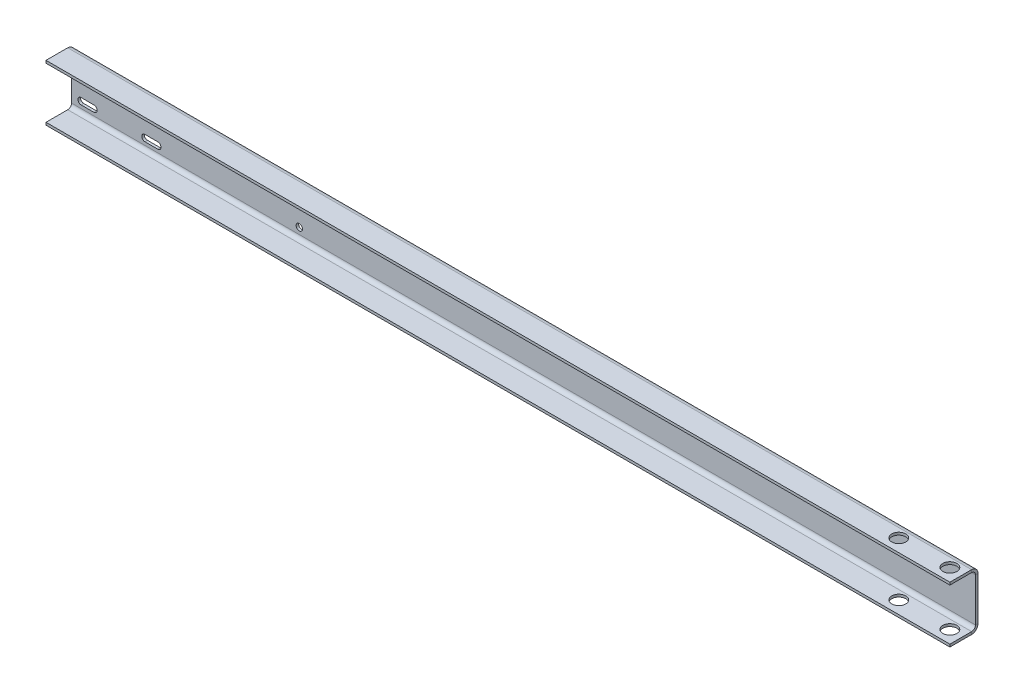
ISO-10303-21;
HEADER;
FILE_DESCRIPTION(('STEP AP214'),'2;1');
FILE_NAME('part.step','',(''),(''),'','','');
FILE_SCHEMA(('AUTOMOTIVE_DESIGN { 1 0 10303 214 1 1 1 1 }'));
ENDSEC;
DATA;
#1=APPLICATION_CONTEXT('core data for automotive mechanical design processes');
#2=APPLICATION_PROTOCOL_DEFINITION('international standard','automotive_design',2000,#1);
#3=PRODUCT_CONTEXT('',#1,'mechanical');
#4=PRODUCT('Part','Part','',(#3));
#5=PRODUCT_RELATED_PRODUCT_CATEGORY('part','',(#4));
#6=PRODUCT_DEFINITION_FORMATION('','',#4);
#7=PRODUCT_DEFINITION_CONTEXT('part definition',#1,'design');
#8=PRODUCT_DEFINITION('design','',#6,#7);
#9=PRODUCT_DEFINITION_SHAPE('','',#8);
#10=(LENGTH_UNIT() NAMED_UNIT(*) SI_UNIT(.MILLI.,.METRE.));
#11=(NAMED_UNIT(*) PLANE_ANGLE_UNIT() SI_UNIT($,.RADIAN.));
#12=(NAMED_UNIT(*) SI_UNIT($,.STERADIAN.) SOLID_ANGLE_UNIT());
#13=UNCERTAINTY_MEASURE_WITH_UNIT(LENGTH_MEASURE(1.E-05),#10,'distance_accuracy_value','');
#14=(GEOMETRIC_REPRESENTATION_CONTEXT(3) GLOBAL_UNCERTAINTY_ASSIGNED_CONTEXT((#13)) GLOBAL_UNIT_ASSIGNED_CONTEXT((#10,
#11,#12)) REPRESENTATION_CONTEXT('',''));
#15=CARTESIAN_POINT('',(0.,0.,0.));
#16=DIRECTION('',(0.,0.,1.));
#17=DIRECTION('',(1.,0.,0.));
#18=AXIS2_PLACEMENT_3D('',#15,#16,#17);
#19=CARTESIAN_POINT('',(0.,0.,-4.));
#20=DIRECTION('',(0.,0.,-1.));
#21=DIRECTION('',(-1.,0.,0.));
#22=AXIS2_PLACEMENT_3D('',#19,#20,#21);
#23=PLANE('',#22);
#24=CARTESIAN_POINT('',(-509.018987341773,19.9999999999998,-4.));
#25=DIRECTION('',(0.,0.,-1.));
#26=DIRECTION('',(-1.,0.,0.));
#27=AXIS2_PLACEMENT_3D('',#24,#25,#26);
#28=CIRCLE('',#27,5.00000000000004);
#29=CARTESIAN_POINT('',(-514.018987341773,19.9999999999998,-4.));
#30=VERTEX_POINT('',#29);
#31=EDGE_CURVE('E878',#30,#30,#28,.T.);
#32=ORIENTED_EDGE('',*,*,#31,.F.);
#33=EDGE_LOOP('',(#32));
#34=FACE_BOUND('',#33,.T.);
#35=CARTESIAN_POINT('',(-750.518987341773,19.9999999999999,-4.));
#36=DIRECTION('',(0.,0.,-1.));
#37=DIRECTION('',(-1.,0.,0.));
#38=AXIS2_PLACEMENT_3D('',#35,#36,#37);
#39=CIRCLE('',#38,5.);
#40=CARTESIAN_POINT('',(-750.518987341773,14.9999999999999,-4.));
#41=VERTEX_POINT('',#40);
#42=CARTESIAN_POINT('',(-750.518987341773,24.9999999999999,-4.));
#43=VERTEX_POINT('',#42);
#44=EDGE_CURVE('E95',#41,#43,#39,.T.);
#45=ORIENTED_EDGE('',*,*,#44,.F.);
#46=DIRECTION('',(-1.,0.,0.));
#47=VECTOR('',#46,1.);
#48=CARTESIAN_POINT('',(-750.518987341773,14.9999999999999,-4.));
#49=LINE('',#48,#47);
#50=CARTESIAN_POINT('',(-730.518987341773,14.9999999999999,-4.));
#51=VERTEX_POINT('',#50);
#52=EDGE_CURVE('E235',#51,#41,#49,.T.);
#53=ORIENTED_EDGE('',*,*,#52,.F.);
#54=CARTESIAN_POINT('',(-730.518987341773,19.9999999999999,-4.));
#55=DIRECTION('',(0.,0.,-1.));
#56=DIRECTION('',(-1.,0.,0.));
#57=AXIS2_PLACEMENT_3D('',#54,#55,#56);
#58=CIRCLE('',#57,5.);
#59=CARTESIAN_POINT('',(-730.518987341773,24.9999999999999,-4.));
#60=VERTEX_POINT('',#59);
#61=EDGE_CURVE('E220',#60,#51,#58,.T.);
#62=ORIENTED_EDGE('',*,*,#61,.F.);
#63=DIRECTION('',(1.,0.,0.));
#64=VECTOR('',#63,1.);
#65=CARTESIAN_POINT('',(-750.518987341773,24.9999999999999,-4.));
#66=LINE('',#65,#64);
#67=EDGE_CURVE('E229',#43,#60,#66,.T.);
#68=ORIENTED_EDGE('',*,*,#67,.F.);
#69=EDGE_LOOP('',(#45,#53,#62,#68));
#70=FACE_BOUND('',#69,.T.);
#71=CARTESIAN_POINT('',(-850.518987341773,19.9999999999999,-4.));
#72=DIRECTION('',(0.,0.,-1.));
#73=DIRECTION('',(-1.,0.,0.));
#74=AXIS2_PLACEMENT_3D('',#71,#72,#73);
#75=CIRCLE('',#74,5.);
#76=CARTESIAN_POINT('',(-850.518987341773,14.9999999999999,-4.));
#77=VERTEX_POINT('',#76);
#78=CARTESIAN_POINT('',(-850.518987341773,24.9999999999999,-4.));
#79=VERTEX_POINT('',#78);
#80=EDGE_CURVE('E242',#77,#79,#75,.T.);
#81=ORIENTED_EDGE('',*,*,#80,.F.);
#82=DIRECTION('',(-1.,0.,0.));
#83=VECTOR('',#82,1.);
#84=CARTESIAN_POINT('',(-850.518987341773,14.9999999999999,-4.));
#85=LINE('',#84,#83);
#86=CARTESIAN_POINT('',(-830.518987341773,14.9999999999999,-4.));
#87=VERTEX_POINT('',#86);
#88=EDGE_CURVE('E252',#87,#77,#85,.T.);
#89=ORIENTED_EDGE('',*,*,#88,.F.);
#90=CARTESIAN_POINT('',(-830.518987341773,19.9999999999999,-4.));
#91=DIRECTION('',(0.,0.,-1.));
#92=DIRECTION('',(-1.,0.,0.));
#93=AXIS2_PLACEMENT_3D('',#90,#91,#92);
#94=CIRCLE('',#93,5.);
#95=CARTESIAN_POINT('',(-830.518987341773,24.9999999999999,-4.));
#96=VERTEX_POINT('',#95);
#97=EDGE_CURVE('E249',#96,#87,#94,.T.);
#98=ORIENTED_EDGE('',*,*,#97,.F.);
#99=DIRECTION('',(1.,0.,0.));
#100=VECTOR('',#99,1.);
#101=CARTESIAN_POINT('',(-850.518987341773,24.9999999999999,-4.));
#102=LINE('',#101,#100);
#103=EDGE_CURVE('E246',#79,#96,#102,.T.);
#104=ORIENTED_EDGE('',*,*,#103,.F.);
#105=EDGE_LOOP('',(#81,#89,#98,#104));
#106=FACE_BOUND('',#105,.T.);
#107=DIRECTION('',(0.,1.,0.));
#108=VECTOR('',#107,1.);
#109=CARTESIAN_POINT('',(549.481012658227,88.0000000000002,-4.));
#110=LINE('',#109,#108);
#111=CARTESIAN_POINT('',(549.481012658227,9.99999999999997,-3.99999999999986));
#112=VERTEX_POINT('',#111);
#113=CARTESIAN_POINT('',(549.481012658227,78.,-4.));
#114=VERTEX_POINT('',#113);
#115=EDGE_CURVE('E396',#112,#114,#110,.T.);
#116=ORIENTED_EDGE('',*,*,#115,.F.);
#117=DIRECTION('',(1.,0.,0.));
#118=VECTOR('',#117,1.);
#119=CARTESIAN_POINT('',(549.481012658227,9.99999999999997,-3.99999999999986));
#120=LINE('',#119,#118);
#121=CARTESIAN_POINT('',(-865.518987341773,9.99999999999967,-4.));
#122=VERTEX_POINT('',#121);
#123=EDGE_CURVE('E317',#112,#122,#120,.F.);
#124=ORIENTED_EDGE('',*,*,#123,.T.);
#125=DIRECTION('',(0.,-1.,0.));
#126=VECTOR('',#125,1.);
#127=CARTESIAN_POINT('',(-865.518987341773,88.,-4.));
#128=LINE('',#127,#126);
#129=CARTESIAN_POINT('',(-865.518987341773,78.,-4.00000000000008));
#130=VERTEX_POINT('',#129);
#131=EDGE_CURVE('E398',#130,#122,#128,.T.);
#132=ORIENTED_EDGE('',*,*,#131,.F.);
#133=DIRECTION('',(-1.,0.,0.));
#134=VECTOR('',#133,1.);
#135=CARTESIAN_POINT('',(-865.518987341773,78.,-4.00000000000008));
#136=LINE('',#135,#134);
#137=EDGE_CURVE('E372',#130,#114,#136,.F.);
#138=ORIENTED_EDGE('',*,*,#137,.T.);
#139=EDGE_LOOP('',(#116,#124,#132,#138));
#140=FACE_BOUND('',#139,.T.);
#141=ADVANCED_FACE('F79',(#34,#70,#106,#140),#23,.T.);
#142=CARTESIAN_POINT('',(0.,0.,0.));
#143=DIRECTION('',(0.,0.,-1.));
#144=DIRECTION('',(-1.,0.,0.));
#145=AXIS2_PLACEMENT_3D('',#142,#143,#144);
#146=PLANE('',#145);
#147=CARTESIAN_POINT('',(-509.018987341773,19.9999999999998,0.));
#148=DIRECTION('',(0.,0.,-1.));
#149=DIRECTION('',(-1.,0.,0.));
#150=AXIS2_PLACEMENT_3D('',#147,#148,#149);
#151=CIRCLE('',#150,5.00000000000004);
#152=CARTESIAN_POINT('',(-514.018987341773,19.9999999999998,0.));
#153=VERTEX_POINT('',#152);
#154=EDGE_CURVE('E83',#153,#153,#151,.T.);
#155=ORIENTED_EDGE('',*,*,#154,.T.);
#156=EDGE_LOOP('',(#155));
#157=FACE_BOUND('',#156,.T.);
#158=DIRECTION('',(-1.,0.,0.));
#159=VECTOR('',#158,1.);
#160=CARTESIAN_POINT('',(0.,14.9999999999999,0.));
#161=LINE('',#160,#159);
#162=CARTESIAN_POINT('',(-730.518987341773,14.9999999999999,0.));
#163=VERTEX_POINT('',#162);
#164=CARTESIAN_POINT('',(-750.518987341773,14.9999999999999,0.));
#165=VERTEX_POINT('',#164);
#166=EDGE_CURVE('E88',#163,#165,#161,.T.);
#167=ORIENTED_EDGE('',*,*,#166,.T.);
#168=CARTESIAN_POINT('',(-750.518987341773,19.9999999999999,0.));
#169=DIRECTION('',(0.,0.,-1.));
#170=DIRECTION('',(-1.,0.,0.));
#171=AXIS2_PLACEMENT_3D('',#168,#169,#170);
#172=CIRCLE('',#171,5.);
#173=CARTESIAN_POINT('',(-750.518987341773,24.9999999999999,0.));
#174=VERTEX_POINT('',#173);
#175=EDGE_CURVE('E13',#165,#174,#172,.T.);
#176=ORIENTED_EDGE('',*,*,#175,.T.);
#177=DIRECTION('',(1.,0.,0.));
#178=VECTOR('',#177,1.);
#179=CARTESIAN_POINT('',(0.,24.9999999999999,0.));
#180=LINE('',#179,#178);
#181=CARTESIAN_POINT('',(-730.518987341773,24.9999999999999,0.));
#182=VERTEX_POINT('',#181);
#183=EDGE_CURVE('E421',#174,#182,#180,.T.);
#184=ORIENTED_EDGE('',*,*,#183,.T.);
#185=CARTESIAN_POINT('',(-730.518987341773,19.9999999999999,0.));
#186=DIRECTION('',(0.,0.,-1.));
#187=DIRECTION('',(-1.,0.,0.));
#188=AXIS2_PLACEMENT_3D('',#185,#186,#187);
#189=CIRCLE('',#188,5.);
#190=EDGE_CURVE('E223',#182,#163,#189,.T.);
#191=ORIENTED_EDGE('',*,*,#190,.T.);
#192=EDGE_LOOP('',(#167,#176,#184,#191));
#193=FACE_BOUND('',#192,.T.);
#194=DIRECTION('',(-1.,0.,0.));
#195=VECTOR('',#194,1.);
#196=CARTESIAN_POINT('',(0.,14.9999999999999,0.));
#197=LINE('',#196,#195);
#198=CARTESIAN_POINT('',(-830.518987341773,14.9999999999999,0.));
#199=VERTEX_POINT('',#198);
#200=CARTESIAN_POINT('',(-850.518987341773,14.9999999999999,0.));
#201=VERTEX_POINT('',#200);
#202=EDGE_CURVE('E415',#199,#201,#197,.T.);
#203=ORIENTED_EDGE('',*,*,#202,.T.);
#204=CARTESIAN_POINT('',(-850.518987341773,19.9999999999999,0.));
#205=DIRECTION('',(0.,0.,-1.));
#206=DIRECTION('',(-1.,0.,0.));
#207=AXIS2_PLACEMENT_3D('',#204,#205,#206);
#208=CIRCLE('',#207,5.);
#209=CARTESIAN_POINT('',(-850.518987341773,24.9999999999999,0.));
#210=VERTEX_POINT('',#209);
#211=EDGE_CURVE('E418',#201,#210,#208,.T.);
#212=ORIENTED_EDGE('',*,*,#211,.T.);
#213=DIRECTION('',(1.,0.,0.));
#214=VECTOR('',#213,1.);
#215=CARTESIAN_POINT('',(0.,24.9999999999999,0.));
#216=LINE('',#215,#214);
#217=CARTESIAN_POINT('',(-830.518987341773,24.9999999999999,0.));
#218=VERTEX_POINT('',#217);
#219=EDGE_CURVE('E402',#210,#218,#216,.T.);
#220=ORIENTED_EDGE('',*,*,#219,.T.);
#221=CARTESIAN_POINT('',(-830.518987341773,19.9999999999999,0.));
#222=DIRECTION('',(0.,0.,-1.));
#223=DIRECTION('',(-1.,0.,0.));
#224=AXIS2_PLACEMENT_3D('',#221,#222,#223);
#225=CIRCLE('',#224,5.);
#226=EDGE_CURVE('E412',#218,#199,#225,.T.);
#227=ORIENTED_EDGE('',*,*,#226,.T.);
#228=EDGE_LOOP('',(#203,#212,#220,#227));
#229=FACE_BOUND('',#228,.T.);
#230=DIRECTION('',(1.,0.,0.));
#231=VECTOR('',#230,1.);
#232=CARTESIAN_POINT('',(549.481012658227,10.,1.38777878078145E-13));
#233=LINE('',#232,#231);
#234=CARTESIAN_POINT('',(549.481012658227,10.,1.38777878078145E-13));
#235=VERTEX_POINT('',#234);
#236=CARTESIAN_POINT('',(-865.518987341773,9.99999999999964,1.38777878078145E-13));
#237=VERTEX_POINT('',#236);
#238=EDGE_CURVE('E330',#235,#237,#233,.F.);
#239=ORIENTED_EDGE('',*,*,#238,.F.);
#240=DIRECTION('',(0.,1.,0.));
#241=VECTOR('',#240,1.);
#242=CARTESIAN_POINT('',(549.481012658227,88.0000000000002,0.));
#243=LINE('',#242,#241);
#244=CARTESIAN_POINT('',(549.481012658227,78.,0.));
#245=VERTEX_POINT('',#244);
#246=EDGE_CURVE('E393',#235,#245,#243,.T.);
#247=ORIENTED_EDGE('',*,*,#246,.T.);
#248=DIRECTION('',(-1.,0.,0.));
#249=VECTOR('',#248,1.);
#250=CARTESIAN_POINT('',(-865.518987341773,78.,0.));
#251=LINE('',#250,#249);
#252=CARTESIAN_POINT('',(-865.518987341773,78.,0.));
#253=VERTEX_POINT('',#252);
#254=EDGE_CURVE('E385',#253,#245,#251,.F.);
#255=ORIENTED_EDGE('',*,*,#254,.F.);
#256=DIRECTION('',(0.,-1.,0.));
#257=VECTOR('',#256,1.);
#258=CARTESIAN_POINT('',(-865.518987341773,88.,0.));
#259=LINE('',#258,#257);
#260=EDGE_CURVE('E399',#253,#237,#259,.T.);
#261=ORIENTED_EDGE('',*,*,#260,.T.);
#262=EDGE_LOOP('',(#239,#247,#255,#261));
#263=FACE_BOUND('',#262,.T.);
#264=ADVANCED_FACE('F426',(#157,#193,#229,#263),#146,.F.);
#265=CARTESIAN_POINT('',(549.481012658227,88.0000000000002,-4.));
#266=DIRECTION('',(1.,0.,0.));
#267=DIRECTION('',(0.,0.,-1.));
#268=AXIS2_PLACEMENT_3D('',#265,#266,#267);
#269=PLANE('',#268);
#270=ORIENTED_EDGE('',*,*,#246,.F.);
#271=DIRECTION('',(0.,0.,-1.));
#272=VECTOR('',#271,1.);
#273=CARTESIAN_POINT('',(549.481012658227,10.,1.38777878078145E-13));
#274=LINE('',#273,#272);
#275=EDGE_CURVE('E324',#235,#112,#274,.T.);
#276=ORIENTED_EDGE('',*,*,#275,.T.);
#277=ORIENTED_EDGE('',*,*,#115,.T.);
#278=DIRECTION('',(0.,0.,-1.));
#279=VECTOR('',#278,1.);
#280=CARTESIAN_POINT('',(549.481012658227,78.,0.));
#281=LINE('',#280,#279);
#282=EDGE_CURVE('E390',#245,#114,#281,.T.);
#283=ORIENTED_EDGE('',*,*,#282,.F.);
#284=EDGE_LOOP('',(#270,#276,#277,#283));
#285=FACE_BOUND('',#284,.T.);
#286=ADVANCED_FACE('F81',(#285),#269,.T.);
#287=CARTESIAN_POINT('',(-865.518987341773,88.,-4.));
#288=DIRECTION('',(-1.,0.,0.));
#289=DIRECTION('',(0.,0.,1.));
#290=AXIS2_PLACEMENT_3D('',#287,#288,#289);
#291=PLANE('',#290);
#292=DIRECTION('',(0.,0.,-1.));
#293=VECTOR('',#292,1.);
#294=CARTESIAN_POINT('',(-865.518987341773,9.99999999999964,1.38777878078145E-13));
#295=LINE('',#294,#293);
#296=EDGE_CURVE('E334',#237,#122,#295,.T.);
#297=ORIENTED_EDGE('',*,*,#296,.F.);
#298=ORIENTED_EDGE('',*,*,#260,.F.);
#299=DIRECTION('',(0.,0.,-1.));
#300=VECTOR('',#299,1.);
#301=CARTESIAN_POINT('',(-865.518987341773,78.,0.));
#302=LINE('',#301,#300);
#303=EDGE_CURVE('E379',#253,#130,#302,.T.);
#304=ORIENTED_EDGE('',*,*,#303,.T.);
#305=ORIENTED_EDGE('',*,*,#131,.T.);
#306=EDGE_LOOP('',(#297,#298,#304,#305));
#307=FACE_BOUND('',#306,.T.);
#308=ADVANCED_FACE('F457',(#307),#291,.T.);
#309=CARTESIAN_POINT('',(549.481012658227,78.0000000000001,6.00000000000003));
#310=DIRECTION('',(1.,0.,0.));
#311=DIRECTION('',(0.,0.,-1.));
#312=AXIS2_PLACEMENT_3D('',#309,#310,#311);
#313=PLANE('',#312);
#314=DIRECTION('',(0.,1.,0.));
#315=VECTOR('',#314,1.);
#316=CARTESIAN_POINT('',(549.481012658227,88.0000000000002,5.99999999999996));
#317=LINE('',#316,#315);
#318=CARTESIAN_POINT('',(549.481012658227,84.0000000000002,6.00000000000001));
#319=VERTEX_POINT('',#318);
#320=CARTESIAN_POINT('',(549.481012658227,88.0000000000002,5.99999999999999));
#321=VERTEX_POINT('',#320);
#322=EDGE_CURVE('E337',#319,#321,#317,.T.);
#323=ORIENTED_EDGE('',*,*,#322,.F.);
#324=CARTESIAN_POINT('',(549.481012658227,78.0000000000001,6.00000000000003));
#325=DIRECTION('',(-1.,0.,0.));
#326=DIRECTION('',(0.,0.,1.));
#327=AXIS2_PLACEMENT_3D('',#324,#325,#326);
#328=CIRCLE('',#327,6.0000000000001);
#329=EDGE_CURVE('E382',#245,#319,#328,.F.);
#330=ORIENTED_EDGE('',*,*,#329,.F.);
#331=ORIENTED_EDGE('',*,*,#282,.T.);
#332=CARTESIAN_POINT('',(549.481012658227,78.0000000000001,6.00000000000003));
#333=DIRECTION('',(-1.,0.,0.));
#334=DIRECTION('',(0.,0.,1.));
#335=AXIS2_PLACEMENT_3D('',#332,#333,#334);
#336=CIRCLE('',#335,10.0000000000001);
#337=EDGE_CURVE('E375',#114,#321,#336,.F.);
#338=ORIENTED_EDGE('',*,*,#337,.T.);
#339=EDGE_LOOP('',(#323,#330,#331,#338));
#340=FACE_BOUND('',#339,.T.);
#341=ADVANCED_FACE('F459',(#340),#313,.T.);
#342=CARTESIAN_POINT('',(-865.518987341773,78.0000000000001,6.00000000000003));
#343=DIRECTION('',(1.,0.,0.));
#344=DIRECTION('',(0.,0.,-1.));
#345=AXIS2_PLACEMENT_3D('',#342,#343,#344);
#346=PLANE('',#345);
#347=CARTESIAN_POINT('',(-865.518987341773,78.0000000000001,6.00000000000003));
#348=DIRECTION('',(-1.,0.,0.));
#349=DIRECTION('',(0.,0.,1.));
#350=AXIS2_PLACEMENT_3D('',#347,#348,#349);
#351=CIRCLE('',#350,6.0000000000001);
#352=CARTESIAN_POINT('',(-865.518987341773,84.0000000000002,6.00000000000001));
#353=VERTEX_POINT('',#352);
#354=EDGE_CURVE('E342',#353,#253,#351,.T.);
#355=ORIENTED_EDGE('',*,*,#354,.F.);
#356=DIRECTION('',(0.,1.,0.));
#357=VECTOR('',#356,1.);
#358=CARTESIAN_POINT('',(-865.518987341773,84.,6.00000000000003));
#359=LINE('',#358,#357);
#360=CARTESIAN_POINT('',(-865.518987341773,88.,6.00000000000002));
#361=VERTEX_POINT('',#360);
#362=EDGE_CURVE('E365',#353,#361,#359,.T.);
#363=ORIENTED_EDGE('',*,*,#362,.T.);
#364=CARTESIAN_POINT('',(-865.518987341773,78.0000000000001,6.00000000000003));
#365=DIRECTION('',(-1.,0.,0.));
#366=DIRECTION('',(0.,0.,1.));
#367=AXIS2_PLACEMENT_3D('',#364,#365,#366);
#368=CIRCLE('',#367,10.0000000000001);
#369=EDGE_CURVE('E376',#361,#130,#368,.T.);
#370=ORIENTED_EDGE('',*,*,#369,.T.);
#371=ORIENTED_EDGE('',*,*,#303,.F.);
#372=EDGE_LOOP('',(#355,#363,#370,#371));
#373=FACE_BOUND('',#372,.T.);
#374=ADVANCED_FACE('F455',(#373),#346,.F.);
#375=CARTESIAN_POINT('',(-865.518987341773,78.0000000000001,6.00000000000003));
#376=DIRECTION('',(-1.,0.,0.));
#377=DIRECTION('',(0.,1.,0.));
#378=AXIS2_PLACEMENT_3D('',#375,#376,#377);
#379=CYLINDRICAL_SURFACE('',#378,10.0000000000001);
#380=ORIENTED_EDGE('',*,*,#137,.F.);
#381=ORIENTED_EDGE('',*,*,#369,.F.);
#382=DIRECTION('',(-1.,0.,0.));
#383=VECTOR('',#382,1.);
#384=CARTESIAN_POINT('',(0.,88.0000000000001,5.99999999999999));
#385=LINE('',#384,#383);
#386=EDGE_CURVE('E362',#321,#361,#385,.T.);
#387=ORIENTED_EDGE('',*,*,#386,.F.);
#388=ORIENTED_EDGE('',*,*,#337,.F.);
#389=EDGE_LOOP('',(#380,#381,#387,#388));
#390=FACE_BOUND('',#389,.T.);
#391=ADVANCED_FACE('F486',(#390),#379,.T.);
#392=CARTESIAN_POINT('',(-865.518987341773,78.0000000000001,6.00000000000003));
#393=DIRECTION('',(-1.,0.,0.));
#394=DIRECTION('',(0.,1.,0.));
#395=AXIS2_PLACEMENT_3D('',#392,#393,#394);
#396=CYLINDRICAL_SURFACE('',#395,6.0000000000001);
#397=ORIENTED_EDGE('',*,*,#254,.T.);
#398=ORIENTED_EDGE('',*,*,#329,.T.);
#399=DIRECTION('',(1.,0.,0.));
#400=VECTOR('',#399,1.);
#401=CARTESIAN_POINT('',(549.481012658227,84.0000000000002,5.99999999999998));
#402=LINE('',#401,#400);
#403=EDGE_CURVE('E368',#319,#353,#402,.F.);
#404=ORIENTED_EDGE('',*,*,#403,.T.);
#405=ORIENTED_EDGE('',*,*,#354,.T.);
#406=EDGE_LOOP('',(#397,#398,#404,#405));
#407=FACE_BOUND('',#406,.T.);
#408=ADVANCED_FACE('F478',(#407),#396,.F.);
#409=CARTESIAN_POINT('',(-865.518987341773,88.,0.));
#410=DIRECTION('',(-1.,0.,0.));
#411=DIRECTION('',(0.,-1.,0.));
#412=AXIS2_PLACEMENT_3D('',#409,#410,#411);
#413=PLANE('',#412);
#414=DIRECTION('',(0.,0.,-1.));
#415=VECTOR('',#414,1.);
#416=CARTESIAN_POINT('',(-865.518987341773,88.,0.));
#417=LINE('',#416,#415);
#418=CARTESIAN_POINT('',(-865.518987341773,88.0000000000001,40.));
#419=VERTEX_POINT('',#418);
#420=EDGE_CURVE('E346',#419,#361,#417,.T.);
#421=ORIENTED_EDGE('',*,*,#420,.T.);
#422=ORIENTED_EDGE('',*,*,#362,.F.);
#423=DIRECTION('',(0.,0.,1.));
#424=VECTOR('',#423,1.);
#425=CARTESIAN_POINT('',(-865.518987341773,84.,-3.05311331771918E-13));
#426=LINE('',#425,#424);
#427=CARTESIAN_POINT('',(-865.518987341773,84.0000000000001,40.));
#428=VERTEX_POINT('',#427);
#429=EDGE_CURVE('E354',#428,#353,#426,.F.);
#430=ORIENTED_EDGE('',*,*,#429,.F.);
#431=DIRECTION('',(0.,-1.,0.));
#432=VECTOR('',#431,1.);
#433=CARTESIAN_POINT('',(-865.518987341773,88.0000000000001,40.));
#434=LINE('',#433,#432);
#435=EDGE_CURVE('E340',#419,#428,#434,.T.);
#436=ORIENTED_EDGE('',*,*,#435,.F.);
#437=EDGE_LOOP('',(#421,#422,#430,#436));
#438=FACE_BOUND('',#437,.T.);
#439=ADVANCED_FACE('F504',(#438),#413,.T.);
#440=CARTESIAN_POINT('',(549.481012658227,88.0000000000003,40.));
#441=DIRECTION('',(1.,0.,0.));
#442=DIRECTION('',(0.,1.,0.));
#443=AXIS2_PLACEMENT_3D('',#440,#441,#442);
#444=PLANE('',#443);
#445=DIRECTION('',(0.,0.,-1.));
#446=VECTOR('',#445,1.);
#447=CARTESIAN_POINT('',(549.481012658227,84.0000000000002,-3.05311331771919E-13));
#448=LINE('',#447,#446);
#449=CARTESIAN_POINT('',(549.481012658227,84.0000000000003,40.));
#450=VERTEX_POINT('',#449);
#451=EDGE_CURVE('E360',#319,#450,#448,.F.);
#452=ORIENTED_EDGE('',*,*,#451,.F.);
#453=ORIENTED_EDGE('',*,*,#322,.T.);
#454=DIRECTION('',(0.,0.,1.));
#455=VECTOR('',#454,1.);
#456=CARTESIAN_POINT('',(549.481012658227,88.0000000000003,40.));
#457=LINE('',#456,#455);
#458=CARTESIAN_POINT('',(549.481012658227,88.0000000000003,40.));
#459=VERTEX_POINT('',#458);
#460=EDGE_CURVE('E352',#321,#459,#457,.T.);
#461=ORIENTED_EDGE('',*,*,#460,.T.);
#462=DIRECTION('',(0.,-1.,0.));
#463=VECTOR('',#462,1.);
#464=CARTESIAN_POINT('',(549.481012658227,88.0000000000003,40.));
#465=LINE('',#464,#463);
#466=EDGE_CURVE('E343',#459,#450,#465,.T.);
#467=ORIENTED_EDGE('',*,*,#466,.T.);
#468=EDGE_LOOP('',(#452,#453,#461,#467));
#469=FACE_BOUND('',#468,.T.);
#470=ADVANCED_FACE('F490',(#469),#444,.T.);
#471=CARTESIAN_POINT('',(0.,88.0000000000001,-3.19277257127291E-13));
#472=DIRECTION('',(0.,1.,0.));
#473=DIRECTION('',(0.,0.,1.));
#474=AXIS2_PLACEMENT_3D('',#471,#472,#473);
#475=PLANE('',#474);
#476=CARTESIAN_POINT('',(449.481012658227,88.0000000000006,20.0000000000003));
#477=DIRECTION('',(0.,-1.,0.));
#478=DIRECTION('',(0.,0.,-1.));
#479=AXIS2_PLACEMENT_3D('',#476,#477,#478);
#480=CIRCLE('',#479,11.);
#481=CARTESIAN_POINT('',(449.481012658227,88.0000000000006,9.00000000000028));
#482=VERTEX_POINT('',#481);
#483=EDGE_CURVE('E258',#482,#482,#480,.T.);
#484=ORIENTED_EDGE('',*,*,#483,.T.);
#485=EDGE_LOOP('',(#484));
#486=FACE_BOUND('',#485,.T.);
#487=CARTESIAN_POINT('',(529.481012658227,88.0000000000006,20.0000000000003));
#488=DIRECTION('',(0.,-1.,0.));
#489=DIRECTION('',(0.,0.,-1.));
#490=AXIS2_PLACEMENT_3D('',#487,#488,#489);
#491=CIRCLE('',#490,11.);
#492=CARTESIAN_POINT('',(529.481012658227,88.0000000000006,9.00000000000028));
#493=VERTEX_POINT('',#492);
#494=EDGE_CURVE('E274',#493,#493,#491,.T.);
#495=ORIENTED_EDGE('',*,*,#494,.T.);
#496=EDGE_LOOP('',(#495));
#497=FACE_BOUND('',#496,.T.);
#498=ORIENTED_EDGE('',*,*,#460,.F.);
#499=ORIENTED_EDGE('',*,*,#386,.T.);
#500=ORIENTED_EDGE('',*,*,#420,.F.);
#501=DIRECTION('',(-1.,0.,0.));
#502=VECTOR('',#501,1.);
#503=CARTESIAN_POINT('',(-865.518987341773,88.0000000000001,40.));
#504=LINE('',#503,#502);
#505=EDGE_CURVE('E349',#459,#419,#504,.T.);
#506=ORIENTED_EDGE('',*,*,#505,.F.);
#507=EDGE_LOOP('',(#498,#499,#500,#506));
#508=FACE_BOUND('',#507,.T.);
#509=ADVANCED_FACE('F494',(#486,#497,#508),#475,.T.);
#510=CARTESIAN_POINT('',(0.,84.0000000000001,-3.05311331771918E-13));
#511=DIRECTION('',(0.,1.,0.));
#512=DIRECTION('',(0.,0.,1.));
#513=AXIS2_PLACEMENT_3D('',#510,#511,#512);
#514=PLANE('',#513);
#515=CARTESIAN_POINT('',(449.481012658227,84.0000000000002,20.0000000000003));
#516=DIRECTION('',(0.,1.,0.));
#517=DIRECTION('',(0.,0.,1.));
#518=AXIS2_PLACEMENT_3D('',#515,#516,#517);
#519=CIRCLE('',#518,11.);
#520=CARTESIAN_POINT('',(449.481012658227,84.0000000000003,31.0000000000003));
#521=VERTEX_POINT('',#520);
#522=EDGE_CURVE('E271',#521,#521,#519,.T.);
#523=ORIENTED_EDGE('',*,*,#522,.T.);
#524=EDGE_LOOP('',(#523));
#525=FACE_BOUND('',#524,.T.);
#526=CARTESIAN_POINT('',(529.481012658227,84.0000000000002,20.0000000000003));
#527=DIRECTION('',(0.,1.,0.));
#528=DIRECTION('',(0.,0.,1.));
#529=AXIS2_PLACEMENT_3D('',#526,#527,#528);
#530=CIRCLE('',#529,11.);
#531=CARTESIAN_POINT('',(529.481012658227,84.0000000000003,31.0000000000003));
#532=VERTEX_POINT('',#531);
#533=EDGE_CURVE('E281',#532,#532,#530,.T.);
#534=ORIENTED_EDGE('',*,*,#533,.T.);
#535=EDGE_LOOP('',(#534));
#536=FACE_BOUND('',#535,.T.);
#537=ORIENTED_EDGE('',*,*,#403,.F.);
#538=ORIENTED_EDGE('',*,*,#451,.T.);
#539=DIRECTION('',(1.,0.,0.));
#540=VECTOR('',#539,1.);
#541=CARTESIAN_POINT('',(0.,84.0000000000002,40.));
#542=LINE('',#541,#540);
#543=EDGE_CURVE('E357',#450,#428,#542,.F.);
#544=ORIENTED_EDGE('',*,*,#543,.T.);
#545=ORIENTED_EDGE('',*,*,#429,.T.);
#546=EDGE_LOOP('',(#537,#538,#544,#545));
#547=FACE_BOUND('',#546,.T.);
#548=ADVANCED_FACE('F501',(#525,#536,#547),#514,.F.);
#549=CARTESIAN_POINT('',(-865.518987341773,88.0000000000001,40.));
#550=DIRECTION('',(0.,0.,1.));
#551=DIRECTION('',(0.,-1.,0.));
#552=AXIS2_PLACEMENT_3D('',#549,#550,#551);
#553=PLANE('',#552);
#554=ORIENTED_EDGE('',*,*,#543,.F.);
#555=ORIENTED_EDGE('',*,*,#466,.F.);
#556=ORIENTED_EDGE('',*,*,#505,.T.);
#557=ORIENTED_EDGE('',*,*,#435,.T.);
#558=EDGE_LOOP('',(#554,#555,#556,#557));
#559=FACE_BOUND('',#558,.T.);
#560=ADVANCED_FACE('F498',(#559),#553,.T.);
#561=CARTESIAN_POINT('',(-865.518987341773,9.99999999999975,6.00000000000002));
#562=DIRECTION('',(-1.,0.,0.));
#563=DIRECTION('',(0.,-1.,0.));
#564=AXIS2_PLACEMENT_3D('',#561,#562,#563);
#565=PLANE('',#564);
#566=DIRECTION('',(0.,-1.,0.));
#567=VECTOR('',#566,1.);
#568=CARTESIAN_POINT('',(-865.518987341773,-1.26753006330052E-13,5.99999999999996));
#569=LINE('',#568,#567);
#570=CARTESIAN_POINT('',(-865.518987341773,3.99999999999987,6.));
#571=VERTEX_POINT('',#570);
#572=CARTESIAN_POINT('',(-865.518987341773,-1.26634813746307E-13,5.99999999999999));
#573=VERTEX_POINT('',#572);
#574=EDGE_CURVE('E284',#571,#573,#569,.T.);
#575=ORIENTED_EDGE('',*,*,#574,.F.);
#576=CARTESIAN_POINT('',(-865.518987341773,9.99999999999975,6.00000000000002));
#577=DIRECTION('',(1.,0.,0.));
#578=DIRECTION('',(0.,1.,0.));
#579=AXIS2_PLACEMENT_3D('',#576,#577,#578);
#580=CIRCLE('',#579,5.99999999999988);
#581=EDGE_CURVE('E327',#237,#571,#580,.F.);
#582=ORIENTED_EDGE('',*,*,#581,.F.);
#583=ORIENTED_EDGE('',*,*,#296,.T.);
#584=CARTESIAN_POINT('',(-865.518987341773,9.99999999999975,6.00000000000002));
#585=DIRECTION('',(1.,0.,0.));
#586=DIRECTION('',(0.,1.,0.));
#587=AXIS2_PLACEMENT_3D('',#584,#585,#586);
#588=CIRCLE('',#587,9.99999999999988);
#589=EDGE_CURVE('E320',#122,#573,#588,.F.);
#590=ORIENTED_EDGE('',*,*,#589,.T.);
#591=EDGE_LOOP('',(#575,#582,#583,#590));
#592=FACE_BOUND('',#591,.T.);
#593=ADVANCED_FACE('F527',(#592),#565,.T.);
#594=CARTESIAN_POINT('',(549.481012658227,10.0000000000002,6.00000000000002));
#595=DIRECTION('',(-1.,0.,0.));
#596=DIRECTION('',(0.,-1.,0.));
#597=AXIS2_PLACEMENT_3D('',#594,#595,#596);
#598=PLANE('',#597);
#599=CARTESIAN_POINT('',(549.481012658227,10.0000000000002,6.00000000000002));
#600=DIRECTION('',(1.,0.,0.));
#601=DIRECTION('',(0.,1.,0.));
#602=AXIS2_PLACEMENT_3D('',#599,#600,#601);
#603=CIRCLE('',#602,5.99999999999988);
#604=CARTESIAN_POINT('',(549.481012658227,4.00000000000028,6.));
#605=VERTEX_POINT('',#604);
#606=EDGE_CURVE('E287',#605,#235,#603,.T.);
#607=ORIENTED_EDGE('',*,*,#606,.F.);
#608=DIRECTION('',(0.,-1.,0.));
#609=VECTOR('',#608,1.);
#610=CARTESIAN_POINT('',(549.481012658227,4.00000000000005,6.00000000000002));
#611=LINE('',#610,#609);
#612=CARTESIAN_POINT('',(549.481012658227,0.,6.00000000000001));
#613=VERTEX_POINT('',#612);
#614=EDGE_CURVE('E310',#605,#613,#611,.T.);
#615=ORIENTED_EDGE('',*,*,#614,.T.);
#616=CARTESIAN_POINT('',(549.481012658227,10.0000000000002,6.00000000000002));
#617=DIRECTION('',(1.,0.,0.));
#618=DIRECTION('',(0.,1.,0.));
#619=AXIS2_PLACEMENT_3D('',#616,#617,#618);
#620=CIRCLE('',#619,9.99999999999988);
#621=EDGE_CURVE('E321',#613,#112,#620,.T.);
#622=ORIENTED_EDGE('',*,*,#621,.T.);
#623=ORIENTED_EDGE('',*,*,#275,.F.);
#624=EDGE_LOOP('',(#607,#615,#622,#623));
#625=FACE_BOUND('',#624,.T.);
#626=ADVANCED_FACE('F510',(#625),#598,.F.);
#627=CARTESIAN_POINT('',(549.481012658227,10.0000000000002,6.00000000000002));
#628=DIRECTION('',(1.,0.,0.));
#629=DIRECTION('',(0.,-1.,0.));
#630=AXIS2_PLACEMENT_3D('',#627,#628,#629);
#631=CYLINDRICAL_SURFACE('',#630,9.99999999999988);
#632=ORIENTED_EDGE('',*,*,#123,.F.);
#633=ORIENTED_EDGE('',*,*,#621,.F.);
#634=DIRECTION('',(1.,0.,0.));
#635=VECTOR('',#634,1.);
#636=CARTESIAN_POINT('',(0.,0.,5.99999999999999));
#637=LINE('',#636,#635);
#638=EDGE_CURVE('E307',#573,#613,#637,.T.);
#639=ORIENTED_EDGE('',*,*,#638,.F.);
#640=ORIENTED_EDGE('',*,*,#589,.F.);
#641=EDGE_LOOP('',(#632,#633,#639,#640));
#642=FACE_BOUND('',#641,.T.);
#643=ADVANCED_FACE('F507',(#642),#631,.T.);
#644=CARTESIAN_POINT('',(549.481012658227,10.0000000000002,6.00000000000002));
#645=DIRECTION('',(1.,0.,0.));
#646=DIRECTION('',(0.,-1.,0.));
#647=AXIS2_PLACEMENT_3D('',#644,#645,#646);
#648=CYLINDRICAL_SURFACE('',#647,5.99999999999988);
#649=ORIENTED_EDGE('',*,*,#238,.T.);
#650=ORIENTED_EDGE('',*,*,#581,.T.);
#651=DIRECTION('',(-1.,0.,0.));
#652=VECTOR('',#651,1.);
#653=CARTESIAN_POINT('',(-865.518987341773,3.99999999999987,5.99999999999998));
#654=LINE('',#653,#652);
#655=EDGE_CURVE('E313',#571,#605,#654,.F.);
#656=ORIENTED_EDGE('',*,*,#655,.T.);
#657=ORIENTED_EDGE('',*,*,#606,.T.);
#658=EDGE_LOOP('',(#649,#650,#656,#657));
#659=FACE_BOUND('',#658,.T.);
#660=ADVANCED_FACE('F530',(#659),#648,.F.);
#661=CARTESIAN_POINT('',(549.481012658227,0.,0.));
#662=DIRECTION('',(1.,0.,0.));
#663=DIRECTION('',(0.,1.,0.));
#664=AXIS2_PLACEMENT_3D('',#661,#662,#663);
#665=PLANE('',#664);
#666=DIRECTION('',(0.,0.,-1.));
#667=VECTOR('',#666,1.);
#668=CARTESIAN_POINT('',(549.481012658227,0.,0.));
#669=LINE('',#668,#667);
#670=CARTESIAN_POINT('',(549.481012658227,0.,40.));
#671=VERTEX_POINT('',#670);
#672=EDGE_CURVE('E291',#671,#613,#669,.T.);
#673=ORIENTED_EDGE('',*,*,#672,.T.);
#674=ORIENTED_EDGE('',*,*,#614,.F.);
#675=DIRECTION('',(0.,0.,1.));
#676=VECTOR('',#675,1.);
#677=CARTESIAN_POINT('',(549.481012658227,4.00000000000007,0.));
#678=LINE('',#677,#676);
#679=CARTESIAN_POINT('',(549.481012658227,3.99999999999993,40.));
#680=VERTEX_POINT('',#679);
#681=EDGE_CURVE('E299',#680,#605,#678,.F.);
#682=ORIENTED_EDGE('',*,*,#681,.F.);
#683=DIRECTION('',(0.,1.,0.));
#684=VECTOR('',#683,1.);
#685=CARTESIAN_POINT('',(549.481012658227,0.,40.));
#686=LINE('',#685,#684);
#687=EDGE_CURVE('E285',#671,#680,#686,.T.);
#688=ORIENTED_EDGE('',*,*,#687,.F.);
#689=EDGE_LOOP('',(#673,#674,#682,#688));
#690=FACE_BOUND('',#689,.T.);
#691=ADVANCED_FACE('F519',(#690),#665,.T.);
#692=CARTESIAN_POINT('',(-865.518987341773,-2.45463371850718E-13,40.));
#693=DIRECTION('',(-1.,0.,0.));
#694=DIRECTION('',(0.,-1.,0.));
#695=AXIS2_PLACEMENT_3D('',#692,#693,#694);
#696=PLANE('',#695);
#697=DIRECTION('',(0.,0.,-1.));
#698=VECTOR('',#697,1.);
#699=CARTESIAN_POINT('',(-865.518987341773,3.99999999999989,0.));
#700=LINE('',#699,#698);
#701=CARTESIAN_POINT('',(-865.518987341773,3.99999999999975,40.));
#702=VERTEX_POINT('',#701);
#703=EDGE_CURVE('E305',#571,#702,#700,.F.);
#704=ORIENTED_EDGE('',*,*,#703,.F.);
#705=ORIENTED_EDGE('',*,*,#574,.T.);
#706=DIRECTION('',(0.,0.,1.));
#707=VECTOR('',#706,1.);
#708=CARTESIAN_POINT('',(-865.518987341773,-2.45654759298661E-13,40.));
#709=LINE('',#708,#707);
#710=CARTESIAN_POINT('',(-865.518987341773,-2.45654759298661E-13,40.));
#711=VERTEX_POINT('',#710);
#712=EDGE_CURVE('E297',#573,#711,#709,.T.);
#713=ORIENTED_EDGE('',*,*,#712,.T.);
#714=DIRECTION('',(0.,1.,0.));
#715=VECTOR('',#714,1.);
#716=CARTESIAN_POINT('',(-865.518987341773,-2.45463371850718E-13,40.));
#717=LINE('',#716,#715);
#718=EDGE_CURVE('E288',#711,#702,#717,.T.);
#719=ORIENTED_EDGE('',*,*,#718,.T.);
#720=EDGE_LOOP('',(#704,#705,#713,#719));
#721=FACE_BOUND('',#720,.T.);
#722=ADVANCED_FACE('F526',(#721),#696,.T.);
#723=CARTESIAN_POINT('',(0.,0.,0.));
#724=DIRECTION('',(0.,-1.,0.));
#725=DIRECTION('',(0.,0.,-1.));
#726=AXIS2_PLACEMENT_3D('',#723,#724,#725);
#727=PLANE('',#726);
#728=CARTESIAN_POINT('',(449.481012658227,0.,20.));
#729=DIRECTION('',(0.,-1.,0.));
#730=DIRECTION('',(0.,0.,-1.));
#731=AXIS2_PLACEMENT_3D('',#728,#729,#730);
#732=CIRCLE('',#731,11.);
#733=CARTESIAN_POINT('',(449.481012658227,0.,8.99999999999997));
#734=VERTEX_POINT('',#733);
#735=EDGE_CURVE('E268',#734,#734,#732,.T.);
#736=ORIENTED_EDGE('',*,*,#735,.F.);
#737=EDGE_LOOP('',(#736));
#738=FACE_BOUND('',#737,.T.);
#739=CARTESIAN_POINT('',(529.481012658227,0.,20.));
#740=DIRECTION('',(0.,-1.,0.));
#741=DIRECTION('',(0.,0.,-1.));
#742=AXIS2_PLACEMENT_3D('',#739,#740,#741);
#743=CIRCLE('',#742,11.);
#744=CARTESIAN_POINT('',(529.481012658227,0.,8.99999999999997));
#745=VERTEX_POINT('',#744);
#746=EDGE_CURVE('E278',#745,#745,#743,.T.);
#747=ORIENTED_EDGE('',*,*,#746,.F.);
#748=EDGE_LOOP('',(#747));
#749=FACE_BOUND('',#748,.T.);
#750=ORIENTED_EDGE('',*,*,#712,.F.);
#751=ORIENTED_EDGE('',*,*,#638,.T.);
#752=ORIENTED_EDGE('',*,*,#672,.F.);
#753=DIRECTION('',(1.,0.,0.));
#754=VECTOR('',#753,1.);
#755=CARTESIAN_POINT('',(549.481012658227,0.,40.));
#756=LINE('',#755,#754);
#757=EDGE_CURVE('E294',#711,#671,#756,.T.);
#758=ORIENTED_EDGE('',*,*,#757,.F.);
#759=EDGE_LOOP('',(#750,#751,#752,#758));
#760=FACE_BOUND('',#759,.T.);
#761=ADVANCED_FACE('F517',(#738,#749,#760),#727,.T.);
#762=CARTESIAN_POINT('',(0.,4.,0.));
#763=DIRECTION('',(0.,-1.,0.));
#764=DIRECTION('',(0.,0.,-1.));
#765=AXIS2_PLACEMENT_3D('',#762,#763,#764);
#766=PLANE('',#765);
#767=CARTESIAN_POINT('',(449.481012658227,3.99999999999999,20.));
#768=DIRECTION('',(0.,-1.,0.));
#769=DIRECTION('',(0.,0.,-1.));
#770=AXIS2_PLACEMENT_3D('',#767,#768,#769);
#771=CIRCLE('',#770,11.);
#772=CARTESIAN_POINT('',(449.481012658227,4.00000000000003,8.99999999999998));
#773=VERTEX_POINT('',#772);
#774=EDGE_CURVE('E267',#773,#773,#771,.T.);
#775=ORIENTED_EDGE('',*,*,#774,.T.);
#776=EDGE_LOOP('',(#775));
#777=FACE_BOUND('',#776,.T.);
#778=CARTESIAN_POINT('',(529.481012658227,4.,20.));
#779=DIRECTION('',(0.,-1.,0.));
#780=DIRECTION('',(0.,0.,-1.));
#781=AXIS2_PLACEMENT_3D('',#778,#779,#780);
#782=CIRCLE('',#781,11.);
#783=CARTESIAN_POINT('',(529.481012658227,4.00000000000004,8.99999999999998));
#784=VERTEX_POINT('',#783);
#785=EDGE_CURVE('E277',#784,#784,#782,.T.);
#786=ORIENTED_EDGE('',*,*,#785,.T.);
#787=EDGE_LOOP('',(#786));
#788=FACE_BOUND('',#787,.T.);
#789=ORIENTED_EDGE('',*,*,#655,.F.);
#790=ORIENTED_EDGE('',*,*,#703,.T.);
#791=DIRECTION('',(-1.,0.,0.));
#792=VECTOR('',#791,1.);
#793=CARTESIAN_POINT('',(0.,3.99999999999986,40.));
#794=LINE('',#793,#792);
#795=EDGE_CURVE('E302',#702,#680,#794,.F.);
#796=ORIENTED_EDGE('',*,*,#795,.T.);
#797=ORIENTED_EDGE('',*,*,#681,.T.);
#798=EDGE_LOOP('',(#789,#790,#796,#797));
#799=FACE_BOUND('',#798,.T.);
#800=ADVANCED_FACE('F532',(#777,#788,#799),#766,.F.);
#801=CARTESIAN_POINT('',(549.481012658227,0.,40.));
#802=DIRECTION('',(0.,0.,1.));
#803=DIRECTION('',(0.,-1.,0.));
#804=AXIS2_PLACEMENT_3D('',#801,#802,#803);
#805=PLANE('',#804);
#806=ORIENTED_EDGE('',*,*,#795,.F.);
#807=ORIENTED_EDGE('',*,*,#718,.F.);
#808=ORIENTED_EDGE('',*,*,#757,.T.);
#809=ORIENTED_EDGE('',*,*,#687,.T.);
#810=EDGE_LOOP('',(#806,#807,#808,#809));
#811=FACE_BOUND('',#810,.T.);
#812=ADVANCED_FACE('F523',(#811),#805,.T.);
#813=CARTESIAN_POINT('',(529.481012658227,88.0000000000006,20.0000000000003));
#814=DIRECTION('',(0.,-1.,0.));
#815=DIRECTION('',(0.,0.,-1.));
#816=AXIS2_PLACEMENT_3D('',#813,#814,#815);
#817=CYLINDRICAL_SURFACE('',#816,11.);
#818=ORIENTED_EDGE('',*,*,#746,.T.);
#819=EDGE_LOOP('',(#818));
#820=FACE_BOUND('',#819,.T.);
#821=ORIENTED_EDGE('',*,*,#785,.F.);
#822=EDGE_LOOP('',(#821));
#823=FACE_BOUND('',#822,.T.);
#824=ADVANCED_FACE('F540',(#820,#823),#817,.F.);
#825=ORIENTED_EDGE('',*,*,#494,.F.);
#826=EDGE_LOOP('',(#825));
#827=FACE_BOUND('',#826,.T.);
#828=ORIENTED_EDGE('',*,*,#533,.F.);
#829=EDGE_LOOP('',(#828));
#830=FACE_BOUND('',#829,.T.);
#831=ADVANCED_FACE('F645',(#827,#830),#817,.F.);
#832=CARTESIAN_POINT('',(449.481012658227,88.0000000000006,20.0000000000003));
#833=DIRECTION('',(0.,-1.,0.));
#834=DIRECTION('',(0.,0.,-1.));
#835=AXIS2_PLACEMENT_3D('',#832,#833,#834);
#836=CYLINDRICAL_SURFACE('',#835,11.);
#837=ORIENTED_EDGE('',*,*,#735,.T.);
#838=EDGE_LOOP('',(#837));
#839=FACE_BOUND('',#838,.T.);
#840=ORIENTED_EDGE('',*,*,#774,.F.);
#841=EDGE_LOOP('',(#840));
#842=FACE_BOUND('',#841,.T.);
#843=ADVANCED_FACE('F655',(#839,#842),#836,.F.);
#844=ORIENTED_EDGE('',*,*,#483,.F.);
#845=EDGE_LOOP('',(#844));
#846=FACE_BOUND('',#845,.T.);
#847=ORIENTED_EDGE('',*,*,#522,.F.);
#848=EDGE_LOOP('',(#847));
#849=FACE_BOUND('',#848,.T.);
#850=ADVANCED_FACE('F665',(#846,#849),#836,.F.);
#851=CARTESIAN_POINT('',(-850.518987341773,19.9999999999999,40.));
#852=DIRECTION('',(0.,0.,-1.));
#853=DIRECTION('',(-1.,0.,0.));
#854=AXIS2_PLACEMENT_3D('',#851,#852,#853);
#855=CYLINDRICAL_SURFACE('',#854,5.);
#856=DIRECTION('',(0.,0.,-1.));
#857=VECTOR('',#856,1.);
#858=CARTESIAN_POINT('',(-850.518987341773,14.9999999999999,40.));
#859=LINE('',#858,#857);
#860=EDGE_CURVE('E256',#201,#77,#859,.T.);
#861=ORIENTED_EDGE('',*,*,#860,.T.);
#862=ORIENTED_EDGE('',*,*,#80,.T.);
#863=DIRECTION('',(0.,0.,-1.));
#864=VECTOR('',#863,1.);
#865=CARTESIAN_POINT('',(-850.518987341773,24.9999999999999,40.));
#866=LINE('',#865,#864);
#867=EDGE_CURVE('E255',#210,#79,#866,.T.);
#868=ORIENTED_EDGE('',*,*,#867,.F.);
#869=ORIENTED_EDGE('',*,*,#211,.F.);
#870=EDGE_LOOP('',(#861,#862,#868,#869));
#871=FACE_BOUND('',#870,.T.);
#872=ADVANCED_FACE('F676',(#871),#855,.F.);
#873=CARTESIAN_POINT('',(-850.518987341773,14.9999999999999,40.));
#874=DIRECTION('',(0.,-1.,0.));
#875=DIRECTION('',(0.,0.,-1.));
#876=AXIS2_PLACEMENT_3D('',#873,#874,#875);
#877=PLANE('',#876);
#878=DIRECTION('',(0.,0.,-1.));
#879=VECTOR('',#878,1.);
#880=CARTESIAN_POINT('',(-830.518987341773,14.9999999999999,40.));
#881=LINE('',#880,#879);
#882=EDGE_CURVE('E259',#199,#87,#881,.T.);
#883=ORIENTED_EDGE('',*,*,#882,.T.);
#884=ORIENTED_EDGE('',*,*,#88,.T.);
#885=ORIENTED_EDGE('',*,*,#860,.F.);
#886=ORIENTED_EDGE('',*,*,#202,.F.);
#887=EDGE_LOOP('',(#883,#884,#885,#886));
#888=FACE_BOUND('',#887,.T.);
#889=ADVANCED_FACE('F686',(#888),#877,.F.);
#890=CARTESIAN_POINT('',(-830.518987341773,19.9999999999999,40.));
#891=DIRECTION('',(0.,0.,-1.));
#892=DIRECTION('',(-1.,0.,0.));
#893=AXIS2_PLACEMENT_3D('',#890,#891,#892);
#894=CYLINDRICAL_SURFACE('',#893,5.);
#895=DIRECTION('',(0.,0.,-1.));
#896=VECTOR('',#895,1.);
#897=CARTESIAN_POINT('',(-830.518987341773,24.9999999999999,40.));
#898=LINE('',#897,#896);
#899=EDGE_CURVE('E261',#218,#96,#898,.T.);
#900=ORIENTED_EDGE('',*,*,#899,.T.);
#901=ORIENTED_EDGE('',*,*,#97,.T.);
#902=ORIENTED_EDGE('',*,*,#882,.F.);
#903=ORIENTED_EDGE('',*,*,#226,.F.);
#904=EDGE_LOOP('',(#900,#901,#902,#903));
#905=FACE_BOUND('',#904,.T.);
#906=ADVANCED_FACE('F440',(#905),#894,.F.);
#907=CARTESIAN_POINT('',(-850.518987341773,24.9999999999999,40.));
#908=DIRECTION('',(0.,1.,0.));
#909=DIRECTION('',(0.,0.,1.));
#910=AXIS2_PLACEMENT_3D('',#907,#908,#909);
#911=PLANE('',#910);
#912=ORIENTED_EDGE('',*,*,#867,.T.);
#913=ORIENTED_EDGE('',*,*,#103,.T.);
#914=ORIENTED_EDGE('',*,*,#899,.F.);
#915=ORIENTED_EDGE('',*,*,#219,.F.);
#916=EDGE_LOOP('',(#912,#913,#914,#915));
#917=FACE_BOUND('',#916,.T.);
#918=ADVANCED_FACE('F433',(#917),#911,.F.);
#919=CARTESIAN_POINT('',(-750.518987341773,19.9999999999999,40.));
#920=DIRECTION('',(0.,0.,-1.));
#921=DIRECTION('',(-1.,0.,0.));
#922=AXIS2_PLACEMENT_3D('',#919,#920,#921);
#923=CYLINDRICAL_SURFACE('',#922,5.);
#924=DIRECTION('',(0.,0.,-1.));
#925=VECTOR('',#924,1.);
#926=CARTESIAN_POINT('',(-750.518987341773,14.9999999999999,40.));
#927=LINE('',#926,#925);
#928=EDGE_CURVE('E240',#165,#41,#927,.T.);
#929=ORIENTED_EDGE('',*,*,#928,.T.);
#930=ORIENTED_EDGE('',*,*,#44,.T.);
#931=DIRECTION('',(0.,0.,-1.));
#932=VECTOR('',#931,1.);
#933=CARTESIAN_POINT('',(-750.518987341773,24.9999999999999,40.));
#934=LINE('',#933,#932);
#935=EDGE_CURVE('E226',#174,#43,#934,.T.);
#936=ORIENTED_EDGE('',*,*,#935,.F.);
#937=ORIENTED_EDGE('',*,*,#175,.F.);
#938=EDGE_LOOP('',(#929,#930,#936,#937));
#939=FACE_BOUND('',#938,.T.);
#940=ADVANCED_FACE('F431',(#939),#923,.F.);
#941=CARTESIAN_POINT('',(-750.518987341773,14.9999999999999,40.));
#942=DIRECTION('',(0.,-1.,0.));
#943=DIRECTION('',(0.,0.,-1.));
#944=AXIS2_PLACEMENT_3D('',#941,#942,#943);
#945=PLANE('',#944);
#946=DIRECTION('',(0.,0.,-1.));
#947=VECTOR('',#946,1.);
#948=CARTESIAN_POINT('',(-730.518987341773,14.9999999999999,40.));
#949=LINE('',#948,#947);
#950=EDGE_CURVE('E225',#163,#51,#949,.T.);
#951=ORIENTED_EDGE('',*,*,#950,.T.);
#952=ORIENTED_EDGE('',*,*,#52,.T.);
#953=ORIENTED_EDGE('',*,*,#928,.F.);
#954=ORIENTED_EDGE('',*,*,#166,.F.);
#955=EDGE_LOOP('',(#951,#952,#953,#954));
#956=FACE_BOUND('',#955,.T.);
#957=ADVANCED_FACE('F430',(#956),#945,.F.);
#958=CARTESIAN_POINT('',(-730.518987341773,19.9999999999999,40.));
#959=DIRECTION('',(0.,0.,-1.));
#960=DIRECTION('',(-1.,0.,0.));
#961=AXIS2_PLACEMENT_3D('',#958,#959,#960);
#962=CYLINDRICAL_SURFACE('',#961,5.);
#963=DIRECTION('',(0.,0.,-1.));
#964=VECTOR('',#963,1.);
#965=CARTESIAN_POINT('',(-730.518987341773,24.9999999999999,40.));
#966=LINE('',#965,#964);
#967=EDGE_CURVE('E103',#182,#60,#966,.T.);
#968=ORIENTED_EDGE('',*,*,#967,.T.);
#969=ORIENTED_EDGE('',*,*,#61,.T.);
#970=ORIENTED_EDGE('',*,*,#950,.F.);
#971=ORIENTED_EDGE('',*,*,#190,.F.);
#972=EDGE_LOOP('',(#968,#969,#970,#971));
#973=FACE_BOUND('',#972,.T.);
#974=ADVANCED_FACE('F217',(#973),#962,.F.);
#975=CARTESIAN_POINT('',(-750.518987341773,24.9999999999999,40.));
#976=DIRECTION('',(0.,1.,0.));
#977=DIRECTION('',(0.,0.,1.));
#978=AXIS2_PLACEMENT_3D('',#975,#976,#977);
#979=PLANE('',#978);
#980=ORIENTED_EDGE('',*,*,#935,.T.);
#981=ORIENTED_EDGE('',*,*,#67,.T.);
#982=ORIENTED_EDGE('',*,*,#967,.F.);
#983=ORIENTED_EDGE('',*,*,#183,.F.);
#984=EDGE_LOOP('',(#980,#981,#982,#983));
#985=FACE_BOUND('',#984,.T.);
#986=ADVANCED_FACE('F230',(#985),#979,.F.);
#987=CARTESIAN_POINT('',(-509.018987341773,19.9999999999998,6.));
#988=DIRECTION('',(0.,0.,-1.));
#989=DIRECTION('',(-1.,0.,0.));
#990=AXIS2_PLACEMENT_3D('',#987,#988,#989);
#991=CYLINDRICAL_SURFACE('',#990,5.00000000000004);
#992=ORIENTED_EDGE('',*,*,#31,.T.);
#993=EDGE_LOOP('',(#992));
#994=FACE_BOUND('',#993,.T.);
#995=ORIENTED_EDGE('',*,*,#154,.F.);
#996=EDGE_LOOP('',(#995));
#997=FACE_BOUND('',#996,.T.);
#998=ADVANCED_FACE('F743',(#994,#997),#991,.F.);
#999=CLOSED_SHELL('',(#141,#264,#286,#308,#341,#374,#391,#408,#439,#470,#509,#548,#560,#593,
#626,#643,#660,#691,#722,#761,#800,#812,#824,#831,#843,#850,#872,#889,#906,#918,#940,#957,#974,
#986,#998));
#1000=MANIFOLD_SOLID_BREP('B2',#999);
#1001=ADVANCED_BREP_SHAPE_REPRESENTATION('',(#18,#1000),#14);
#1002=SHAPE_DEFINITION_REPRESENTATION(#9,#1001);
ENDSEC;
END-ISO-10303-21;
